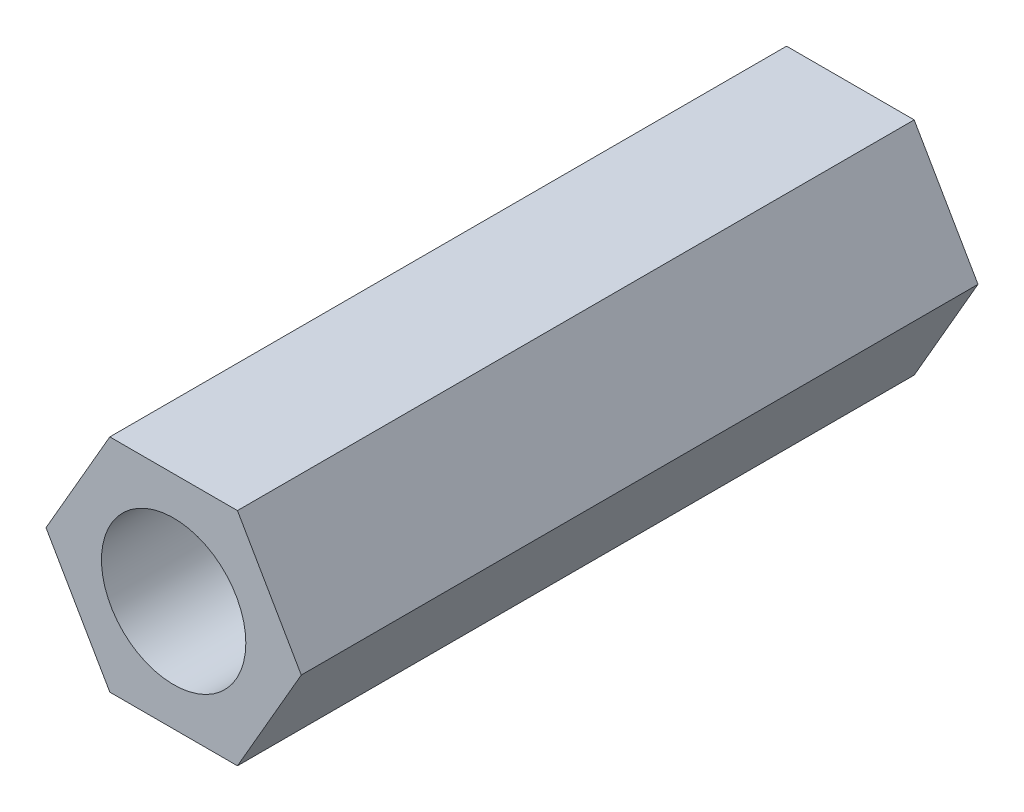
ISO-10303-21;
HEADER;
FILE_DESCRIPTION(('STEP AP214'),'2;1');
FILE_NAME('part.step','',(''),(''),'','','');
FILE_SCHEMA(('AUTOMOTIVE_DESIGN { 1 0 10303 214 1 1 1 1 }'));
ENDSEC;
DATA;
#1=APPLICATION_CONTEXT('core data for automotive mechanical design processes');
#2=APPLICATION_PROTOCOL_DEFINITION('international standard','automotive_design',2000,#1);
#3=PRODUCT_CONTEXT('',#1,'mechanical');
#4=PRODUCT('Part','Part','',(#3));
#5=PRODUCT_RELATED_PRODUCT_CATEGORY('part','',(#4));
#6=PRODUCT_DEFINITION_FORMATION('','',#4);
#7=PRODUCT_DEFINITION_CONTEXT('part definition',#1,'design');
#8=PRODUCT_DEFINITION('design','',#6,#7);
#9=PRODUCT_DEFINITION_SHAPE('','',#8);
#10=(LENGTH_UNIT() NAMED_UNIT(*) SI_UNIT(.MILLI.,.METRE.));
#11=(NAMED_UNIT(*) PLANE_ANGLE_UNIT() SI_UNIT($,.RADIAN.));
#12=(NAMED_UNIT(*) SI_UNIT($,.STERADIAN.) SOLID_ANGLE_UNIT());
#13=UNCERTAINTY_MEASURE_WITH_UNIT(LENGTH_MEASURE(1.E-05),#10,'distance_accuracy_value','');
#14=(GEOMETRIC_REPRESENTATION_CONTEXT(3) GLOBAL_UNCERTAINTY_ASSIGNED_CONTEXT((#13)) GLOBAL_UNIT_ASSIGNED_CONTEXT((#10,
#11,#12)) REPRESENTATION_CONTEXT('',''));
#15=CARTESIAN_POINT('',(0.,0.,0.));
#16=DIRECTION('',(0.,0.,1.));
#17=DIRECTION('',(1.,0.,0.));
#18=AXIS2_PLACEMENT_3D('',#15,#16,#17);
#19=CARTESIAN_POINT('',(0.,0.,15.));
#20=DIRECTION('',(0.,0.,1.));
#21=DIRECTION('',(1.,0.,0.));
#22=AXIS2_PLACEMENT_3D('',#19,#20,#21);
#23=PLANE('',#22);
#24=DIRECTION('',(0.5,0.866025403784439,0.));
#25=VECTOR('',#24,1.);
#26=CARTESIAN_POINT('',(1.41450815951458,-2.45,15.));
#27=LINE('',#26,#25);
#28=CARTESIAN_POINT('',(1.41450815951458,-2.45,15.));
#29=VERTEX_POINT('',#28);
#30=CARTESIAN_POINT('',(2.82901631902917,0.,15.));
#31=VERTEX_POINT('',#30);
#32=EDGE_CURVE('E146',#29,#31,#27,.T.);
#33=ORIENTED_EDGE('',*,*,#32,.T.);
#34=DIRECTION('',(-0.5,0.866025403784439,0.));
#35=VECTOR('',#34,1.);
#36=CARTESIAN_POINT('',(2.82901631902917,0.,15.));
#37=LINE('',#36,#35);
#38=CARTESIAN_POINT('',(1.41450815951458,2.45,15.));
#39=VERTEX_POINT('',#38);
#40=EDGE_CURVE('E94',#31,#39,#37,.T.);
#41=ORIENTED_EDGE('',*,*,#40,.T.);
#42=DIRECTION('',(-1.,0.,0.));
#43=VECTOR('',#42,1.);
#44=CARTESIAN_POINT('',(1.41450815951458,2.45,15.));
#45=LINE('',#44,#43);
#46=CARTESIAN_POINT('',(-1.41450815951458,2.45,15.));
#47=VERTEX_POINT('',#46);
#48=EDGE_CURVE('E107',#39,#47,#45,.T.);
#49=ORIENTED_EDGE('',*,*,#48,.T.);
#50=DIRECTION('',(-0.5,-0.866025403784439,0.));
#51=VECTOR('',#50,1.);
#52=CARTESIAN_POINT('',(-1.41450815951458,2.45,15.));
#53=LINE('',#52,#51);
#54=CARTESIAN_POINT('',(-2.82901631902917,0.,15.));
#55=VERTEX_POINT('',#54);
#56=EDGE_CURVE('E101',#47,#55,#53,.T.);
#57=ORIENTED_EDGE('',*,*,#56,.T.);
#58=DIRECTION('',(0.5,-0.866025403784439,0.));
#59=VECTOR('',#58,1.);
#60=CARTESIAN_POINT('',(-2.82901631902917,0.,15.));
#61=LINE('',#60,#59);
#62=CARTESIAN_POINT('',(-1.41450815951458,-2.45,15.));
#63=VERTEX_POINT('',#62);
#64=EDGE_CURVE('E105',#55,#63,#61,.T.);
#65=ORIENTED_EDGE('',*,*,#64,.T.);
#66=DIRECTION('',(1.,0.,0.));
#67=VECTOR('',#66,1.);
#68=CARTESIAN_POINT('',(-1.41450815951458,-2.45,15.));
#69=LINE('',#68,#67);
#70=EDGE_CURVE('E57',#63,#29,#69,.T.);
#71=ORIENTED_EDGE('',*,*,#70,.T.);
#72=EDGE_LOOP('',(#33,#41,#49,#57,#65,#71));
#73=FACE_BOUND('',#72,.T.);
#74=CARTESIAN_POINT('',(0.,0.,15.));
#75=DIRECTION('',(0.,0.,1.));
#76=DIRECTION('',(1.,0.,0.));
#77=AXIS2_PLACEMENT_3D('',#74,#75,#76);
#78=CIRCLE('',#77,1.6);
#79=CARTESIAN_POINT('',(1.6,0.,15.));
#80=VERTEX_POINT('',#79);
#81=EDGE_CURVE('E134',#80,#80,#78,.T.);
#82=ORIENTED_EDGE('',*,*,#81,.F.);
#83=EDGE_LOOP('',(#82));
#84=FACE_BOUND('',#83,.T.);
#85=ADVANCED_FACE('F39',(#73,#84),#23,.T.);
#86=CARTESIAN_POINT('',(0.,0.,0.));
#87=DIRECTION('',(0.,0.,1.));
#88=DIRECTION('',(1.,0.,0.));
#89=AXIS2_PLACEMENT_3D('',#86,#87,#88);
#90=PLANE('',#89);
#91=DIRECTION('',(0.5,0.866025403784439,0.));
#92=VECTOR('',#91,1.);
#93=CARTESIAN_POINT('',(1.41450815951458,-2.45,0.));
#94=LINE('',#93,#92);
#95=CARTESIAN_POINT('',(1.41450815951458,-2.45,0.));
#96=VERTEX_POINT('',#95);
#97=CARTESIAN_POINT('',(2.82901631902917,0.,0.));
#98=VERTEX_POINT('',#97);
#99=EDGE_CURVE('E129',#96,#98,#94,.T.);
#100=ORIENTED_EDGE('',*,*,#99,.F.);
#101=DIRECTION('',(1.,0.,0.));
#102=VECTOR('',#101,1.);
#103=CARTESIAN_POINT('',(-1.41450815951458,-2.45,0.));
#104=LINE('',#103,#102);
#105=CARTESIAN_POINT('',(-1.41450815951458,-2.45,0.));
#106=VERTEX_POINT('',#105);
#107=EDGE_CURVE('E86',#106,#96,#104,.T.);
#108=ORIENTED_EDGE('',*,*,#107,.F.);
#109=DIRECTION('',(0.5,-0.866025403784439,0.));
#110=VECTOR('',#109,1.);
#111=CARTESIAN_POINT('',(-2.82901631902917,0.,0.));
#112=LINE('',#111,#110);
#113=CARTESIAN_POINT('',(-2.82901631902917,0.,0.));
#114=VERTEX_POINT('',#113);
#115=EDGE_CURVE('E80',#114,#106,#112,.T.);
#116=ORIENTED_EDGE('',*,*,#115,.F.);
#117=DIRECTION('',(-0.5,-0.866025403784439,0.));
#118=VECTOR('',#117,1.);
#119=CARTESIAN_POINT('',(-1.41450815951458,2.45,0.));
#120=LINE('',#119,#118);
#121=CARTESIAN_POINT('',(-1.41450815951458,2.45,0.));
#122=VERTEX_POINT('',#121);
#123=EDGE_CURVE('E116',#122,#114,#120,.T.);
#124=ORIENTED_EDGE('',*,*,#123,.F.);
#125=DIRECTION('',(-1.,0.,0.));
#126=VECTOR('',#125,1.);
#127=CARTESIAN_POINT('',(1.41450815951458,2.45,0.));
#128=LINE('',#127,#126);
#129=CARTESIAN_POINT('',(1.41450815951458,2.45,0.));
#130=VERTEX_POINT('',#129);
#131=EDGE_CURVE('E137',#130,#122,#128,.T.);
#132=ORIENTED_EDGE('',*,*,#131,.F.);
#133=DIRECTION('',(-0.5,0.866025403784439,0.));
#134=VECTOR('',#133,1.);
#135=CARTESIAN_POINT('',(2.82901631902917,0.,0.));
#136=LINE('',#135,#134);
#137=EDGE_CURVE('E133',#98,#130,#136,.T.);
#138=ORIENTED_EDGE('',*,*,#137,.F.);
#139=EDGE_LOOP('',(#100,#108,#116,#124,#132,#138));
#140=FACE_BOUND('',#139,.T.);
#141=CARTESIAN_POINT('',(0.,0.,0.));
#142=DIRECTION('',(0.,0.,1.));
#143=DIRECTION('',(1.,0.,0.));
#144=AXIS2_PLACEMENT_3D('',#141,#142,#143);
#145=CIRCLE('',#144,1.6);
#146=CARTESIAN_POINT('',(1.6,0.,0.));
#147=VERTEX_POINT('',#146);
#148=EDGE_CURVE('E243',#147,#147,#145,.T.);
#149=ORIENTED_EDGE('',*,*,#148,.T.);
#150=EDGE_LOOP('',(#149));
#151=FACE_BOUND('',#150,.T.);
#152=ADVANCED_FACE('F159',(#140,#151),#90,.F.);
#153=CARTESIAN_POINT('',(1.41450815951458,-2.45,15.));
#154=DIRECTION('',(-0.866025403784439,0.5,0.));
#155=DIRECTION('',(-0.5,-0.866025403784439,0.));
#156=AXIS2_PLACEMENT_3D('',#153,#154,#155);
#157=PLANE('',#156);
#158=ORIENTED_EDGE('',*,*,#99,.T.);
#159=DIRECTION('',(0.,0.,-1.));
#160=VECTOR('',#159,1.);
#161=CARTESIAN_POINT('',(2.82901631902917,0.,15.));
#162=LINE('',#161,#160);
#163=EDGE_CURVE('E11',#31,#98,#162,.T.);
#164=ORIENTED_EDGE('',*,*,#163,.F.);
#165=ORIENTED_EDGE('',*,*,#32,.F.);
#166=DIRECTION('',(0.,0.,-1.));
#167=VECTOR('',#166,1.);
#168=CARTESIAN_POINT('',(1.41450815951458,-2.45,15.));
#169=LINE('',#168,#167);
#170=EDGE_CURVE('E125',#29,#96,#169,.T.);
#171=ORIENTED_EDGE('',*,*,#170,.T.);
#172=EDGE_LOOP('',(#158,#164,#165,#171));
#173=FACE_BOUND('',#172,.T.);
#174=ADVANCED_FACE('F41',(#173),#157,.F.);
#175=CARTESIAN_POINT('',(2.82901631902917,0.,15.));
#176=DIRECTION('',(-0.866025403784439,-0.5,0.));
#177=DIRECTION('',(0.5,-0.866025403784439,0.));
#178=AXIS2_PLACEMENT_3D('',#175,#176,#177);
#179=PLANE('',#178);
#180=ORIENTED_EDGE('',*,*,#137,.T.);
#181=DIRECTION('',(0.,0.,-1.));
#182=VECTOR('',#181,1.);
#183=CARTESIAN_POINT('',(1.41450815951458,2.45,15.));
#184=LINE('',#183,#182);
#185=EDGE_CURVE('E49',#39,#130,#184,.T.);
#186=ORIENTED_EDGE('',*,*,#185,.F.);
#187=ORIENTED_EDGE('',*,*,#40,.F.);
#188=ORIENTED_EDGE('',*,*,#163,.T.);
#189=EDGE_LOOP('',(#180,#186,#187,#188));
#190=FACE_BOUND('',#189,.T.);
#191=ADVANCED_FACE('F184',(#190),#179,.F.);
#192=CARTESIAN_POINT('',(1.41450815951458,2.45,15.));
#193=DIRECTION('',(0.,-1.,0.));
#194=DIRECTION('',(0.,0.,-1.));
#195=AXIS2_PLACEMENT_3D('',#192,#193,#194);
#196=PLANE('',#195);
#197=ORIENTED_EDGE('',*,*,#131,.T.);
#198=DIRECTION('',(0.,0.,-1.));
#199=VECTOR('',#198,1.);
#200=CARTESIAN_POINT('',(-1.41450815951458,2.45,15.));
#201=LINE('',#200,#199);
#202=EDGE_CURVE('E118',#47,#122,#201,.T.);
#203=ORIENTED_EDGE('',*,*,#202,.F.);
#204=ORIENTED_EDGE('',*,*,#48,.F.);
#205=ORIENTED_EDGE('',*,*,#185,.T.);
#206=EDGE_LOOP('',(#197,#203,#204,#205));
#207=FACE_BOUND('',#206,.T.);
#208=ADVANCED_FACE('F156',(#207),#196,.F.);
#209=CARTESIAN_POINT('',(-1.41450815951458,2.45,15.));
#210=DIRECTION('',(0.866025403784438,-0.5,0.));
#211=DIRECTION('',(0.5,0.866025403784439,0.));
#212=AXIS2_PLACEMENT_3D('',#209,#210,#211);
#213=PLANE('',#212);
#214=ORIENTED_EDGE('',*,*,#123,.T.);
#215=DIRECTION('',(0.,0.,-1.));
#216=VECTOR('',#215,1.);
#217=CARTESIAN_POINT('',(-2.82901631902917,0.,15.));
#218=LINE('',#217,#216);
#219=EDGE_CURVE('E113',#55,#114,#218,.T.);
#220=ORIENTED_EDGE('',*,*,#219,.F.);
#221=ORIENTED_EDGE('',*,*,#56,.F.);
#222=ORIENTED_EDGE('',*,*,#202,.T.);
#223=EDGE_LOOP('',(#214,#220,#221,#222));
#224=FACE_BOUND('',#223,.T.);
#225=ADVANCED_FACE('F114',(#224),#213,.F.);
#226=CARTESIAN_POINT('',(-2.82901631902917,0.,15.));
#227=DIRECTION('',(0.866025403784438,0.5,0.));
#228=DIRECTION('',(-0.5,0.866025403784439,0.));
#229=AXIS2_PLACEMENT_3D('',#226,#227,#228);
#230=PLANE('',#229);
#231=ORIENTED_EDGE('',*,*,#115,.T.);
#232=DIRECTION('',(0.,0.,-1.));
#233=VECTOR('',#232,1.);
#234=CARTESIAN_POINT('',(-1.41450815951458,-2.45,15.));
#235=LINE('',#234,#233);
#236=EDGE_CURVE('E119',#63,#106,#235,.T.);
#237=ORIENTED_EDGE('',*,*,#236,.F.);
#238=ORIENTED_EDGE('',*,*,#64,.F.);
#239=ORIENTED_EDGE('',*,*,#219,.T.);
#240=EDGE_LOOP('',(#231,#237,#238,#239));
#241=FACE_BOUND('',#240,.T.);
#242=ADVANCED_FACE('F121',(#241),#230,.F.);
#243=CARTESIAN_POINT('',(-1.41450815951458,-2.45,15.));
#244=DIRECTION('',(0.,1.,0.));
#245=DIRECTION('',(0.,0.,1.));
#246=AXIS2_PLACEMENT_3D('',#243,#244,#245);
#247=PLANE('',#246);
#248=ORIENTED_EDGE('',*,*,#107,.T.);
#249=ORIENTED_EDGE('',*,*,#170,.F.);
#250=ORIENTED_EDGE('',*,*,#70,.F.);
#251=ORIENTED_EDGE('',*,*,#236,.T.);
#252=EDGE_LOOP('',(#248,#249,#250,#251));
#253=FACE_BOUND('',#252,.T.);
#254=ADVANCED_FACE('F164',(#253),#247,.F.);
#255=CARTESIAN_POINT('',(0.,0.,15.));
#256=DIRECTION('',(0.,0.,-1.));
#257=DIRECTION('',(-1.,0.,0.));
#258=AXIS2_PLACEMENT_3D('',#255,#256,#257);
#259=CYLINDRICAL_SURFACE('',#258,1.6);
#260=ORIENTED_EDGE('',*,*,#81,.T.);
#261=EDGE_LOOP('',(#260));
#262=FACE_BOUND('',#261,.T.);
#263=ORIENTED_EDGE('',*,*,#148,.F.);
#264=EDGE_LOOP('',(#263));
#265=FACE_BOUND('',#264,.T.);
#266=ADVANCED_FACE('F166',(#262,#265),#259,.F.);
#267=CLOSED_SHELL('',(#85,#152,#174,#191,#208,#225,#242,#254,#266));
#268=MANIFOLD_SOLID_BREP('B2',#267);
#269=ADVANCED_BREP_SHAPE_REPRESENTATION('',(#18,#268),#14);
#270=SHAPE_DEFINITION_REPRESENTATION(#9,#269);
ENDSEC;
END-ISO-10303-21;
